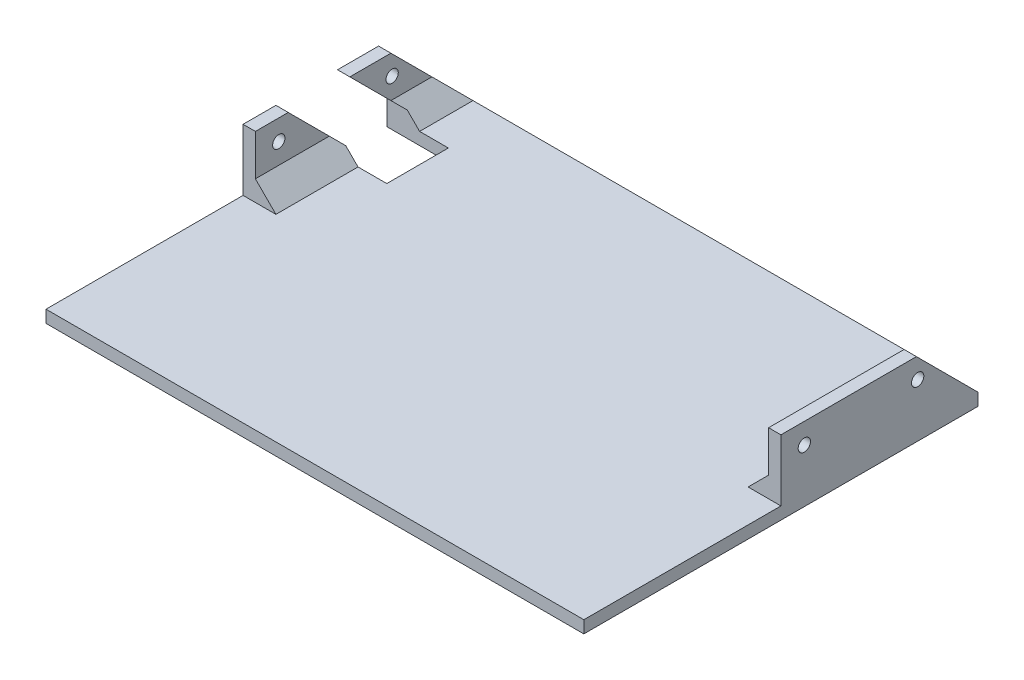
ISO-10303-21;
HEADER;
FILE_DESCRIPTION(('STEP AP214'),'2;1');
FILE_NAME('part.step','',(''),(''),'','','');
FILE_SCHEMA(('AUTOMOTIVE_DESIGN { 1 0 10303 214 1 1 1 1 }'));
ENDSEC;
DATA;
#1=APPLICATION_CONTEXT('core data for automotive mechanical design processes');
#2=APPLICATION_PROTOCOL_DEFINITION('international standard','automotive_design',2000,#1);
#3=PRODUCT_CONTEXT('',#1,'mechanical');
#4=PRODUCT('Part','Part','',(#3));
#5=PRODUCT_RELATED_PRODUCT_CATEGORY('part','',(#4));
#6=PRODUCT_DEFINITION_FORMATION('','',#4);
#7=PRODUCT_DEFINITION_CONTEXT('part definition',#1,'design');
#8=PRODUCT_DEFINITION('design','',#6,#7);
#9=PRODUCT_DEFINITION_SHAPE('','',#8);
#10=(LENGTH_UNIT() NAMED_UNIT(*) SI_UNIT(.MILLI.,.METRE.));
#11=(NAMED_UNIT(*) PLANE_ANGLE_UNIT() SI_UNIT($,.RADIAN.));
#12=(NAMED_UNIT(*) SI_UNIT($,.STERADIAN.) SOLID_ANGLE_UNIT());
#13=UNCERTAINTY_MEASURE_WITH_UNIT(LENGTH_MEASURE(1.E-05),#10,'distance_accuracy_value','');
#14=(GEOMETRIC_REPRESENTATION_CONTEXT(3) GLOBAL_UNCERTAINTY_ASSIGNED_CONTEXT((#13)) GLOBAL_UNIT_ASSIGNED_CONTEXT((#10,
#11,#12)) REPRESENTATION_CONTEXT('',''));
#15=CARTESIAN_POINT('',(0.,0.,0.));
#16=DIRECTION('',(0.,0.,1.));
#17=DIRECTION('',(1.,0.,0.));
#18=AXIS2_PLACEMENT_3D('',#15,#16,#17);
#19=CARTESIAN_POINT('',(-65.5,1.5,0.));
#20=DIRECTION('',(-1.,0.,0.));
#21=DIRECTION('',(0.,0.,1.));
#22=AXIS2_PLACEMENT_3D('',#19,#20,#21);
#23=PLANE('',#22);
#24=DIRECTION('',(0.,-1.,0.));
#25=VECTOR('',#24,1.);
#26=CARTESIAN_POINT('',(-65.5,4.5,-35.));
#27=LINE('',#26,#25);
#28=CARTESIAN_POINT('',(-65.5,4.5,-35.));
#29=VERTEX_POINT('',#28);
#30=CARTESIAN_POINT('',(-65.5,-1.5,-35.));
#31=VERTEX_POINT('',#30);
#32=EDGE_CURVE('E213',#29,#31,#27,.T.);
#33=ORIENTED_EDGE('',*,*,#32,.F.);
#34=DIRECTION('',(0.,-0.707106781186548,-0.707106781186547));
#35=VECTOR('',#34,1.);
#36=CARTESIAN_POINT('',(-65.5,16.5,-23.));
#37=LINE('',#36,#35);
#38=CARTESIAN_POINT('',(-65.5,16.5,-23.));
#39=VERTEX_POINT('',#38);
#40=EDGE_CURVE('E462',#39,#29,#37,.T.);
#41=ORIENTED_EDGE('',*,*,#40,.F.);
#42=DIRECTION('',(0.,0.,1.));
#43=VECTOR('',#42,1.);
#44=CARTESIAN_POINT('',(-65.5,16.5,0.));
#45=LINE('',#44,#43);
#46=CARTESIAN_POINT('',(-65.5,16.5,-32.9999999999998));
#47=VERTEX_POINT('',#46);
#48=EDGE_CURVE('E329',#47,#39,#45,.T.);
#49=ORIENTED_EDGE('',*,*,#48,.F.);
#50=DIRECTION('',(0.,0.707106781186544,0.707106781186551));
#51=VECTOR('',#50,1.);
#52=CARTESIAN_POINT('',(-65.5,24.75,-24.7499999999998));
#53=LINE('',#52,#51);
#54=CARTESIAN_POINT('',(-65.5,1.5,-48.));
#55=VERTEX_POINT('',#54);
#56=EDGE_CURVE('E301',#55,#47,#53,.T.);
#57=ORIENTED_EDGE('',*,*,#56,.F.);
#58=DIRECTION('',(0.,-1.,0.));
#59=VECTOR('',#58,1.);
#60=CARTESIAN_POINT('',(-65.5,1.5,-48.));
#61=LINE('',#60,#59);
#62=CARTESIAN_POINT('',(-65.5,-1.5,-48.));
#63=VERTEX_POINT('',#62);
#64=EDGE_CURVE('E365',#55,#63,#61,.T.);
#65=ORIENTED_EDGE('',*,*,#64,.T.);
#66=DIRECTION('',(0.,0.,-1.));
#67=VECTOR('',#66,1.);
#68=CARTESIAN_POINT('',(-65.5,-1.5,0.));
#69=LINE('',#68,#67);
#70=EDGE_CURVE('E339',#31,#63,#69,.T.);
#71=ORIENTED_EDGE('',*,*,#70,.F.);
#72=EDGE_LOOP('',(#33,#41,#49,#57,#65,#71));
#73=FACE_BOUND('',#72,.T.);
#74=CARTESIAN_POINT('',(-65.5,11.5,-33.3));
#75=DIRECTION('',(-1.,0.,0.));
#76=DIRECTION('',(0.,0.,1.));
#77=AXIS2_PLACEMENT_3D('',#74,#75,#76);
#78=CIRCLE('',#77,1.5);
#79=CARTESIAN_POINT('',(-65.5,11.5,-31.8));
#80=VERTEX_POINT('',#79);
#81=EDGE_CURVE('E321',#80,#80,#78,.T.);
#82=ORIENTED_EDGE('',*,*,#81,.F.);
#83=EDGE_LOOP('',(#82));
#84=FACE_BOUND('',#83,.T.);
#85=ADVANCED_FACE('F42',(#73,#84),#23,.T.);
#86=CARTESIAN_POINT('',(-62.5,16.5,0.));
#87=DIRECTION('',(0.,-1.,0.));
#88=DIRECTION('',(0.,0.,-1.));
#89=AXIS2_PLACEMENT_3D('',#86,#87,#88);
#90=PLANE('',#89);
#91=ORIENTED_EDGE('',*,*,#48,.T.);
#92=DIRECTION('',(-1.,0.,0.));
#93=VECTOR('',#92,1.);
#94=CARTESIAN_POINT('',(-50.5,16.5,-23.));
#95=LINE('',#94,#93);
#96=CARTESIAN_POINT('',(-62.5,16.5,-23.));
#97=VERTEX_POINT('',#96);
#98=EDGE_CURVE('E449',#97,#39,#95,.T.);
#99=ORIENTED_EDGE('',*,*,#98,.F.);
#100=DIRECTION('',(0.,0.,1.));
#101=VECTOR('',#100,1.);
#102=CARTESIAN_POINT('',(-62.5,16.5,0.));
#103=LINE('',#102,#101);
#104=CARTESIAN_POINT('',(-62.5,16.5,-32.9999999999998));
#105=VERTEX_POINT('',#104);
#106=EDGE_CURVE('E310',#105,#97,#103,.T.);
#107=ORIENTED_EDGE('',*,*,#106,.F.);
#108=DIRECTION('',(-1.,0.,0.));
#109=VECTOR('',#108,1.);
#110=CARTESIAN_POINT('',(-62.5,16.5,-32.9999999999998));
#111=LINE('',#110,#109);
#112=EDGE_CURVE('E342',#105,#47,#111,.T.);
#113=ORIENTED_EDGE('',*,*,#112,.T.);
#114=EDGE_LOOP('',(#91,#99,#107,#113));
#115=FACE_BOUND('',#114,.T.);
#116=ADVANCED_FACE('F447',(#115),#90,.F.);
#117=CARTESIAN_POINT('',(-62.5,0.,0.));
#118=DIRECTION('',(-1.,0.,0.));
#119=DIRECTION('',(0.,0.,1.));
#120=AXIS2_PLACEMENT_3D('',#117,#118,#119);
#121=PLANE('',#120);
#122=CARTESIAN_POINT('',(-62.5,11.5,-33.3));
#123=DIRECTION('',(-1.,0.,0.));
#124=DIRECTION('',(0.,0.,1.));
#125=AXIS2_PLACEMENT_3D('',#122,#123,#124);
#126=CIRCLE('',#125,1.5);
#127=CARTESIAN_POINT('',(-62.5,11.5,-31.8));
#128=VERTEX_POINT('',#127);
#129=EDGE_CURVE('E300',#128,#128,#126,.T.);
#130=ORIENTED_EDGE('',*,*,#129,.T.);
#131=EDGE_LOOP('',(#130));
#132=FACE_BOUND('',#131,.T.);
#133=ORIENTED_EDGE('',*,*,#106,.T.);
#134=DIRECTION('',(0.,-0.707106781186548,-0.707106781186547));
#135=VECTOR('',#134,1.);
#136=CARTESIAN_POINT('',(-62.5,19.75,-19.75));
#137=LINE('',#136,#135);
#138=CARTESIAN_POINT('',(-62.5,6.50000000000006,-32.9999999999999));
#139=VERTEX_POINT('',#138);
#140=EDGE_CURVE('E236',#97,#139,#137,.T.);
#141=ORIENTED_EDGE('',*,*,#140,.T.);
#142=DIRECTION('',(0.,0.,-1.));
#143=VECTOR('',#142,1.);
#144=CARTESIAN_POINT('',(-62.5,6.50000000000006,0.));
#145=LINE('',#144,#143);
#146=CARTESIAN_POINT('',(-62.5,6.50000000000006,-42.9999999999999));
#147=VERTEX_POINT('',#146);
#148=EDGE_CURVE('E402',#139,#147,#145,.T.);
#149=ORIENTED_EDGE('',*,*,#148,.T.);
#150=DIRECTION('',(0.,0.707106781186544,0.707106781186551));
#151=VECTOR('',#150,1.);
#152=CARTESIAN_POINT('',(-62.5,24.75,-24.7499999999998));
#153=LINE('',#152,#151);
#154=EDGE_CURVE('E314',#147,#105,#153,.T.);
#155=ORIENTED_EDGE('',*,*,#154,.T.);
#156=EDGE_LOOP('',(#133,#141,#149,#155));
#157=FACE_BOUND('',#156,.T.);
#158=ADVANCED_FACE('F442',(#132,#157),#121,.F.);
#159=CARTESIAN_POINT('',(-62.5,6.50000000000006,0.));
#160=DIRECTION('',(-0.707106781186553,-0.707106781186542,0.));
#161=DIRECTION('',(0.,0.,-1.));
#162=AXIS2_PLACEMENT_3D('',#159,#160,#161);
#163=PLANE('',#162);
#164=DIRECTION('',(0.57735026918962,-0.577350269189629,-0.577350269189629));
#165=VECTOR('',#164,1.);
#166=CARTESIAN_POINT('',(-73.4999999999999,17.5000000000001,-21.9999999999998));
#167=LINE('',#166,#165);
#168=CARTESIAN_POINT('',(-60.5,4.5,-35.));
#169=VERTEX_POINT('',#168);
#170=EDGE_CURVE('E52',#139,#169,#167,.T.);
#171=ORIENTED_EDGE('',*,*,#170,.T.);
#172=DIRECTION('',(0.707106781186542,-0.707106781186553,0.));
#173=VECTOR('',#172,1.);
#174=CARTESIAN_POINT('',(-62.5,6.50000000000006,-35.));
#175=LINE('',#174,#173);
#176=CARTESIAN_POINT('',(-57.5,1.5,-35.));
#177=VERTEX_POINT('',#176);
#178=EDGE_CURVE('E11',#169,#177,#175,.T.);
#179=ORIENTED_EDGE('',*,*,#178,.T.);
#180=DIRECTION('',(0.,0.,1.));
#181=VECTOR('',#180,1.);
#182=CARTESIAN_POINT('',(-57.5,1.5,0.));
#183=LINE('',#182,#181);
#184=CARTESIAN_POINT('',(-57.5,1.5,-48.));
#185=VERTEX_POINT('',#184);
#186=EDGE_CURVE('E391',#185,#177,#183,.T.);
#187=ORIENTED_EDGE('',*,*,#186,.F.);
#188=DIRECTION('',(0.577350269189618,-0.577350269189627,-0.577350269189633));
#189=VECTOR('',#188,1.);
#190=CARTESIAN_POINT('',(-74.6666666666666,18.6666666666668,-30.833333333333));
#191=LINE('',#190,#189);
#192=EDGE_CURVE('E414',#147,#185,#191,.T.);
#193=ORIENTED_EDGE('',*,*,#192,.F.);
#194=ORIENTED_EDGE('',*,*,#148,.F.);
#195=EDGE_LOOP('',(#171,#179,#187,#193,#194));
#196=FACE_BOUND('',#195,.T.);
#197=ADVANCED_FACE('F432',(#196),#163,.F.);
#198=DIRECTION('',(0.,0.707106781186548,0.707106781186547));
#199=VECTOR('',#198,1.);
#200=CARTESIAN_POINT('',(-65.5,4.5,-20.));
#201=LINE('',#200,#199);
#202=CARTESIAN_POINT('',(-65.5,4.5,-20.));
#203=VERTEX_POINT('',#202);
#204=CARTESIAN_POINT('',(-65.5,16.5,-7.99999999999999));
#205=VERTEX_POINT('',#204);
#206=EDGE_CURVE('E465',#203,#205,#201,.T.);
#207=ORIENTED_EDGE('',*,*,#206,.F.);
#208=DIRECTION('',(0.,1.,0.));
#209=VECTOR('',#208,1.);
#210=CARTESIAN_POINT('',(-65.5,-1.5,-20.));
#211=LINE('',#210,#209);
#212=CARTESIAN_POINT('',(-65.5,-1.5,-20.));
#213=VERTEX_POINT('',#212);
#214=EDGE_CURVE('E468',#213,#203,#211,.T.);
#215=ORIENTED_EDGE('',*,*,#214,.F.);
#216=CARTESIAN_POINT('',(-65.5,-1.5,48.));
#217=VERTEX_POINT('',#216);
#218=EDGE_CURVE('E219',#217,#213,#69,.T.);
#219=ORIENTED_EDGE('',*,*,#218,.F.);
#220=DIRECTION('',(0.,-1.,0.));
#221=VECTOR('',#220,1.);
#222=CARTESIAN_POINT('',(-65.5,1.5,48.));
#223=LINE('',#222,#221);
#224=CARTESIAN_POINT('',(-65.5,1.5,48.));
#225=VERTEX_POINT('',#224);
#226=EDGE_CURVE('E387',#225,#217,#223,.T.);
#227=ORIENTED_EDGE('',*,*,#226,.F.);
#228=DIRECTION('',(0.,0.,-1.));
#229=VECTOR('',#228,1.);
#230=CARTESIAN_POINT('',(-65.5,1.5,0.));
#231=LINE('',#230,#229);
#232=CARTESIAN_POINT('',(-65.5,1.5,0.));
#233=VERTEX_POINT('',#232);
#234=EDGE_CURVE('E349',#225,#233,#231,.T.);
#235=ORIENTED_EDGE('',*,*,#234,.T.);
#236=DIRECTION('',(0.,-1.,0.));
#237=VECTOR('',#236,1.);
#238=CARTESIAN_POINT('',(-65.5,0.,0.));
#239=LINE('',#238,#237);
#240=CARTESIAN_POINT('',(-65.5,16.5,0.));
#241=VERTEX_POINT('',#240);
#242=EDGE_CURVE('E325',#241,#233,#239,.T.);
#243=ORIENTED_EDGE('',*,*,#242,.F.);
#244=EDGE_CURVE('E328',#205,#241,#45,.T.);
#245=ORIENTED_EDGE('',*,*,#244,.F.);
#246=EDGE_LOOP('',(#207,#215,#219,#227,#235,#243,#245));
#247=FACE_BOUND('',#246,.T.);
#248=CARTESIAN_POINT('',(-65.5,11.5,-5.69999999999999));
#249=DIRECTION('',(-1.,0.,0.));
#250=DIRECTION('',(0.,0.,1.));
#251=AXIS2_PLACEMENT_3D('',#248,#249,#250);
#252=CIRCLE('',#251,1.5);
#253=CARTESIAN_POINT('',(-65.5,11.5,-4.19999999999999));
#254=VERTEX_POINT('',#253);
#255=EDGE_CURVE('E289',#254,#254,#252,.T.);
#256=ORIENTED_EDGE('',*,*,#255,.F.);
#257=EDGE_LOOP('',(#256));
#258=FACE_BOUND('',#257,.T.);
#259=ADVANCED_FACE('F473',(#247,#258),#23,.T.);
#260=CARTESIAN_POINT('',(0.,1.5,48.));
#261=DIRECTION('',(0.,0.,1.));
#262=DIRECTION('',(1.,0.,0.));
#263=AXIS2_PLACEMENT_3D('',#260,#261,#262);
#264=PLANE('',#263);
#265=DIRECTION('',(-1.,0.,0.));
#266=VECTOR('',#265,1.);
#267=CARTESIAN_POINT('',(0.,-1.5,48.));
#268=LINE('',#267,#266);
#269=CARTESIAN_POINT('',(65.5,-1.5,48.));
#270=VERTEX_POINT('',#269);
#271=EDGE_CURVE('E368',#270,#217,#268,.T.);
#272=ORIENTED_EDGE('',*,*,#271,.F.);
#273=DIRECTION('',(0.,-1.,0.));
#274=VECTOR('',#273,1.);
#275=CARTESIAN_POINT('',(65.5,1.5,48.));
#276=LINE('',#275,#274);
#277=CARTESIAN_POINT('',(65.5,1.5,48.));
#278=VERTEX_POINT('',#277);
#279=EDGE_CURVE('E384',#278,#270,#276,.T.);
#280=ORIENTED_EDGE('',*,*,#279,.F.);
#281=DIRECTION('',(-1.,0.,0.));
#282=VECTOR('',#281,1.);
#283=CARTESIAN_POINT('',(0.,1.5,48.));
#284=LINE('',#283,#282);
#285=EDGE_CURVE('E353',#278,#225,#284,.T.);
#286=ORIENTED_EDGE('',*,*,#285,.T.);
#287=ORIENTED_EDGE('',*,*,#226,.T.);
#288=EDGE_LOOP('',(#272,#280,#286,#287));
#289=FACE_BOUND('',#288,.T.);
#290=ADVANCED_FACE('F505',(#289),#264,.T.);
#291=CARTESIAN_POINT('',(65.5,1.5,0.));
#292=DIRECTION('',(-1.,0.,0.));
#293=DIRECTION('',(0.,0.,1.));
#294=AXIS2_PLACEMENT_3D('',#291,#292,#293);
#295=PLANE('',#294);
#296=DIRECTION('',(0.,0.,-1.));
#297=VECTOR('',#296,1.);
#298=CARTESIAN_POINT('',(65.5,-1.5,0.));
#299=LINE('',#298,#297);
#300=CARTESIAN_POINT('',(65.5,-1.5,-48.));
#301=VERTEX_POINT('',#300);
#302=EDGE_CURVE('E371',#270,#301,#299,.T.);
#303=ORIENTED_EDGE('',*,*,#302,.T.);
#304=DIRECTION('',(0.,-1.,0.));
#305=VECTOR('',#304,1.);
#306=CARTESIAN_POINT('',(65.5,1.5,-48.));
#307=LINE('',#306,#305);
#308=CARTESIAN_POINT('',(65.5,1.5,-48.));
#309=VERTEX_POINT('',#308);
#310=EDGE_CURVE('E380',#309,#301,#307,.T.);
#311=ORIENTED_EDGE('',*,*,#310,.F.);
#312=DIRECTION('',(0.,0.707106781186544,0.707106781186551));
#313=VECTOR('',#312,1.);
#314=CARTESIAN_POINT('',(65.5,24.75,-24.7499999999998));
#315=LINE('',#314,#313);
#316=CARTESIAN_POINT('',(65.5,16.5,-32.9999999999998));
#317=VERTEX_POINT('',#316);
#318=EDGE_CURVE('E279',#309,#317,#315,.T.);
#319=ORIENTED_EDGE('',*,*,#318,.T.);
#320=DIRECTION('',(0.,0.,1.));
#321=VECTOR('',#320,1.);
#322=CARTESIAN_POINT('',(65.5,16.5,0.));
#323=LINE('',#322,#321);
#324=CARTESIAN_POINT('',(65.5,16.5,0.));
#325=VERTEX_POINT('',#324);
#326=EDGE_CURVE('E252',#317,#325,#323,.T.);
#327=ORIENTED_EDGE('',*,*,#326,.T.);
#328=DIRECTION('',(0.,-1.,0.));
#329=VECTOR('',#328,1.);
#330=CARTESIAN_POINT('',(65.5,0.,0.));
#331=LINE('',#330,#329);
#332=CARTESIAN_POINT('',(65.5,1.5,0.));
#333=VERTEX_POINT('',#332);
#334=EDGE_CURVE('E275',#325,#333,#331,.T.);
#335=ORIENTED_EDGE('',*,*,#334,.T.);
#336=DIRECTION('',(0.,0.,-1.));
#337=VECTOR('',#336,1.);
#338=CARTESIAN_POINT('',(65.5,1.5,0.));
#339=LINE('',#338,#337);
#340=EDGE_CURVE('E358',#278,#333,#339,.T.);
#341=ORIENTED_EDGE('',*,*,#340,.F.);
#342=ORIENTED_EDGE('',*,*,#279,.T.);
#343=EDGE_LOOP('',(#303,#311,#319,#327,#335,#341,#342));
#344=FACE_BOUND('',#343,.T.);
#345=CARTESIAN_POINT('',(65.5,11.5,-5.69999999999999));
#346=DIRECTION('',(-1.,0.,0.));
#347=DIRECTION('',(0.,0.,1.));
#348=AXIS2_PLACEMENT_3D('',#345,#346,#347);
#349=CIRCLE('',#348,1.5);
#350=CARTESIAN_POINT('',(65.5,11.5,-4.19999999999999));
#351=VERTEX_POINT('',#350);
#352=EDGE_CURVE('E246',#351,#351,#349,.T.);
#353=ORIENTED_EDGE('',*,*,#352,.T.);
#354=EDGE_LOOP('',(#353));
#355=FACE_BOUND('',#354,.T.);
#356=CARTESIAN_POINT('',(65.5,11.5,-33.3));
#357=DIRECTION('',(-1.,0.,0.));
#358=DIRECTION('',(0.,0.,1.));
#359=AXIS2_PLACEMENT_3D('',#356,#357,#358);
#360=CIRCLE('',#359,1.5);
#361=CARTESIAN_POINT('',(65.5,11.5,-31.8));
#362=VERTEX_POINT('',#361);
#363=EDGE_CURVE('E271',#362,#362,#360,.T.);
#364=ORIENTED_EDGE('',*,*,#363,.T.);
#365=EDGE_LOOP('',(#364));
#366=FACE_BOUND('',#365,.T.);
#367=ADVANCED_FACE('F509',(#344,#355,#366),#295,.F.);
#368=CARTESIAN_POINT('',(0.,1.5,-48.));
#369=DIRECTION('',(0.,0.,1.));
#370=DIRECTION('',(1.,0.,0.));
#371=AXIS2_PLACEMENT_3D('',#368,#369,#370);
#372=PLANE('',#371);
#373=DIRECTION('',(-1.,0.,0.));
#374=VECTOR('',#373,1.);
#375=CARTESIAN_POINT('',(0.,-1.5,-48.));
#376=LINE('',#375,#374);
#377=EDGE_CURVE('E354',#301,#63,#376,.T.);
#378=ORIENTED_EDGE('',*,*,#377,.T.);
#379=ORIENTED_EDGE('',*,*,#64,.F.);
#380=DIRECTION('',(-1.,0.,0.));
#381=VECTOR('',#380,1.);
#382=CARTESIAN_POINT('',(-62.5,1.5,-48.));
#383=LINE('',#382,#381);
#384=EDGE_CURVE('E67',#185,#55,#383,.T.);
#385=ORIENTED_EDGE('',*,*,#384,.F.);
#386=DIRECTION('',(-1.,0.,0.));
#387=VECTOR('',#386,1.);
#388=CARTESIAN_POINT('',(0.,1.5,-48.));
#389=LINE('',#388,#387);
#390=CARTESIAN_POINT('',(57.5,1.5,-48.));
#391=VERTEX_POINT('',#390);
#392=EDGE_CURVE('E361',#391,#185,#389,.T.);
#393=ORIENTED_EDGE('',*,*,#392,.F.);
#394=EDGE_CURVE('E362',#309,#391,#389,.T.);
#395=ORIENTED_EDGE('',*,*,#394,.F.);
#396=ORIENTED_EDGE('',*,*,#310,.T.);
#397=EDGE_LOOP('',(#378,#379,#385,#393,#395,#396));
#398=FACE_BOUND('',#397,.T.);
#399=ADVANCED_FACE('F521',(#398),#372,.F.);
#400=CARTESIAN_POINT('',(0.,1.5,0.));
#401=DIRECTION('',(0.,1.,0.));
#402=DIRECTION('',(0.,0.,1.));
#403=AXIS2_PLACEMENT_3D('',#400,#401,#402);
#404=PLANE('',#403);
#405=DIRECTION('',(-1.,0.,0.));
#406=VECTOR('',#405,1.);
#407=CARTESIAN_POINT('',(0.,1.5,-35.));
#408=LINE('',#407,#406);
#409=CARTESIAN_POINT('',(-50.5,1.5,-35.));
#410=VERTEX_POINT('',#409);
#411=EDGE_CURVE('E240',#410,#177,#408,.T.);
#412=ORIENTED_EDGE('',*,*,#411,.F.);
#413=DIRECTION('',(0.,0.,1.));
#414=VECTOR('',#413,1.);
#415=CARTESIAN_POINT('',(-50.5,1.5,0.));
#416=LINE('',#415,#414);
#417=CARTESIAN_POINT('',(-50.5,1.5,-20.));
#418=VERTEX_POINT('',#417);
#419=EDGE_CURVE('E243',#410,#418,#416,.T.);
#420=ORIENTED_EDGE('',*,*,#419,.T.);
#421=DIRECTION('',(1.,0.,0.));
#422=VECTOR('',#421,1.);
#423=CARTESIAN_POINT('',(0.,1.5,-20.));
#424=LINE('',#423,#422);
#425=CARTESIAN_POINT('',(-57.5,1.5,-20.));
#426=VERTEX_POINT('',#425);
#427=EDGE_CURVE('E199',#426,#418,#424,.T.);
#428=ORIENTED_EDGE('',*,*,#427,.F.);
#429=CARTESIAN_POINT('',(-57.5,1.5,0.));
#430=VERTEX_POINT('',#429);
#431=EDGE_CURVE('E390',#426,#430,#183,.T.);
#432=ORIENTED_EDGE('',*,*,#431,.T.);
#433=DIRECTION('',(-1.,0.,0.));
#434=VECTOR('',#433,1.);
#435=CARTESIAN_POINT('',(-62.5,1.5,0.));
#436=LINE('',#435,#434);
#437=EDGE_CURVE('E335',#430,#233,#436,.T.);
#438=ORIENTED_EDGE('',*,*,#437,.T.);
#439=ORIENTED_EDGE('',*,*,#234,.F.);
#440=ORIENTED_EDGE('',*,*,#285,.F.);
#441=ORIENTED_EDGE('',*,*,#340,.T.);
#442=DIRECTION('',(1.,0.,0.));
#443=VECTOR('',#442,1.);
#444=CARTESIAN_POINT('',(62.5,1.5,0.));
#445=LINE('',#444,#443);
#446=CARTESIAN_POINT('',(57.5,1.5,0.));
#447=VERTEX_POINT('',#446);
#448=EDGE_CURVE('E267',#447,#333,#445,.T.);
#449=ORIENTED_EDGE('',*,*,#448,.F.);
#450=DIRECTION('',(0.,0.,-1.));
#451=VECTOR('',#450,1.);
#452=CARTESIAN_POINT('',(57.5,1.5,0.));
#453=LINE('',#452,#451);
#454=EDGE_CURVE('E395',#447,#391,#453,.T.);
#455=ORIENTED_EDGE('',*,*,#454,.T.);
#456=ORIENTED_EDGE('',*,*,#392,.T.);
#457=ORIENTED_EDGE('',*,*,#186,.T.);
#458=EDGE_LOOP('',(#412,#420,#428,#432,#438,#439,#440,#441,#449,#455,#456,#457));
#459=FACE_BOUND('',#458,.T.);
#460=ADVANCED_FACE('F494',(#459),#404,.T.);
#461=CARTESIAN_POINT('',(0.,-1.5,0.));
#462=DIRECTION('',(0.,1.,0.));
#463=DIRECTION('',(0.,0.,1.));
#464=AXIS2_PLACEMENT_3D('',#461,#462,#463);
#465=PLANE('',#464);
#466=DIRECTION('',(0.,0.,1.));
#467=VECTOR('',#466,1.);
#468=CARTESIAN_POINT('',(-50.5,-1.5,-35.));
#469=LINE('',#468,#467);
#470=CARTESIAN_POINT('',(-50.5,-1.5,-35.));
#471=VERTEX_POINT('',#470);
#472=CARTESIAN_POINT('',(-50.5,-1.5,-20.));
#473=VERTEX_POINT('',#472);
#474=EDGE_CURVE('E204',#471,#473,#469,.T.);
#475=ORIENTED_EDGE('',*,*,#474,.F.);
#476=DIRECTION('',(-1.,0.,0.));
#477=VECTOR('',#476,1.);
#478=CARTESIAN_POINT('',(-50.5,-1.5,-35.));
#479=LINE('',#478,#477);
#480=EDGE_CURVE('E232',#471,#31,#479,.T.);
#481=ORIENTED_EDGE('',*,*,#480,.T.);
#482=ORIENTED_EDGE('',*,*,#70,.T.);
#483=ORIENTED_EDGE('',*,*,#377,.F.);
#484=ORIENTED_EDGE('',*,*,#302,.F.);
#485=ORIENTED_EDGE('',*,*,#271,.T.);
#486=ORIENTED_EDGE('',*,*,#218,.T.);
#487=DIRECTION('',(-1.,0.,0.));
#488=VECTOR('',#487,1.);
#489=CARTESIAN_POINT('',(-50.5,-1.5,-20.));
#490=LINE('',#489,#488);
#491=EDGE_CURVE('E196',#473,#213,#490,.T.);
#492=ORIENTED_EDGE('',*,*,#491,.F.);
#493=EDGE_LOOP('',(#475,#481,#482,#483,#484,#485,#486,#492));
#494=FACE_BOUND('',#493,.T.);
#495=ADVANCED_FACE('F216',(#494),#465,.F.);
#496=CARTESIAN_POINT('',(-62.5,0.,0.));
#497=DIRECTION('',(0.,0.,-1.));
#498=DIRECTION('',(0.,1.,0.));
#499=AXIS2_PLACEMENT_3D('',#496,#497,#498);
#500=PLANE('',#499);
#501=ORIENTED_EDGE('',*,*,#242,.T.);
#502=ORIENTED_EDGE('',*,*,#437,.F.);
#503=DIRECTION('',(-0.707106781186542,0.707106781186553,0.));
#504=VECTOR('',#503,1.);
#505=CARTESIAN_POINT('',(-59.25,3.24999999999998,0.));
#506=LINE('',#505,#504);
#507=CARTESIAN_POINT('',(-62.5,6.50000000000006,0.));
#508=VERTEX_POINT('',#507);
#509=EDGE_CURVE('E418',#430,#508,#506,.T.);
#510=ORIENTED_EDGE('',*,*,#509,.T.);
#511=DIRECTION('',(0.,-1.,0.));
#512=VECTOR('',#511,1.);
#513=CARTESIAN_POINT('',(-62.5,0.,0.));
#514=LINE('',#513,#512);
#515=CARTESIAN_POINT('',(-62.5,16.5,0.));
#516=VERTEX_POINT('',#515);
#517=EDGE_CURVE('E305',#516,#508,#514,.T.);
#518=ORIENTED_EDGE('',*,*,#517,.F.);
#519=DIRECTION('',(-1.,0.,0.));
#520=VECTOR('',#519,1.);
#521=CARTESIAN_POINT('',(-62.5,16.5,0.));
#522=LINE('',#521,#520);
#523=EDGE_CURVE('E317',#516,#241,#522,.T.);
#524=ORIENTED_EDGE('',*,*,#523,.T.);
#525=EDGE_LOOP('',(#501,#502,#510,#518,#524));
#526=FACE_BOUND('',#525,.T.);
#527=ADVANCED_FACE('F499',(#526),#500,.F.);
#528=CARTESIAN_POINT('',(-62.5,24.75,-24.7499999999998));
#529=DIRECTION('',(0.,-0.707106781186551,0.707106781186544));
#530=DIRECTION('',(0.,-0.707106781186544,-0.707106781186551));
#531=AXIS2_PLACEMENT_3D('',#528,#529,#530);
#532=PLANE('',#531);
#533=ORIENTED_EDGE('',*,*,#56,.T.);
#534=ORIENTED_EDGE('',*,*,#112,.F.);
#535=ORIENTED_EDGE('',*,*,#154,.F.);
#536=ORIENTED_EDGE('',*,*,#192,.T.);
#537=ORIENTED_EDGE('',*,*,#384,.T.);
#538=EDGE_LOOP('',(#533,#534,#535,#536,#537));
#539=FACE_BOUND('',#538,.T.);
#540=ADVANCED_FACE('F595',(#539),#532,.F.);
#541=CARTESIAN_POINT('',(-62.5,11.5,-33.3));
#542=DIRECTION('',(-1.,0.,0.));
#543=DIRECTION('',(0.,0.,1.));
#544=AXIS2_PLACEMENT_3D('',#541,#542,#543);
#545=CYLINDRICAL_SURFACE('',#544,1.5);
#546=ORIENTED_EDGE('',*,*,#129,.F.);
#547=EDGE_LOOP('',(#546));
#548=FACE_BOUND('',#547,.T.);
#549=ORIENTED_EDGE('',*,*,#81,.T.);
#550=EDGE_LOOP('',(#549));
#551=FACE_BOUND('',#550,.T.);
#552=ADVANCED_FACE('F599',(#548,#551),#545,.F.);
#553=CARTESIAN_POINT('',(-62.5,11.5,-5.69999999999999));
#554=DIRECTION('',(-1.,0.,0.));
#555=DIRECTION('',(0.,0.,1.));
#556=AXIS2_PLACEMENT_3D('',#553,#554,#555);
#557=CYLINDRICAL_SURFACE('',#556,1.5);
#558=CARTESIAN_POINT('',(-62.5,11.5,-5.69999999999999));
#559=DIRECTION('',(-1.,0.,0.));
#560=DIRECTION('',(0.,0.,1.));
#561=AXIS2_PLACEMENT_3D('',#558,#559,#560);
#562=CIRCLE('',#561,1.5);
#563=CARTESIAN_POINT('',(-62.5,11.5,-4.19999999999999));
#564=VERTEX_POINT('',#563);
#565=EDGE_CURVE('E296',#564,#564,#562,.T.);
#566=ORIENTED_EDGE('',*,*,#565,.F.);
#567=EDGE_LOOP('',(#566));
#568=FACE_BOUND('',#567,.T.);
#569=ORIENTED_EDGE('',*,*,#255,.T.);
#570=EDGE_LOOP('',(#569));
#571=FACE_BOUND('',#570,.T.);
#572=ADVANCED_FACE('F605',(#568,#571),#557,.F.);
#573=CARTESIAN_POINT('',(-62.5,16.5,-7.99999999999999));
#574=VERTEX_POINT('',#573);
#575=EDGE_CURVE('E309',#574,#516,#103,.T.);
#576=ORIENTED_EDGE('',*,*,#575,.F.);
#577=DIRECTION('',(-1.,0.,0.));
#578=VECTOR('',#577,1.);
#579=CARTESIAN_POINT('',(-50.5,16.5,-7.99999999999999));
#580=LINE('',#579,#578);
#581=EDGE_CURVE('E224',#574,#205,#580,.T.);
#582=ORIENTED_EDGE('',*,*,#581,.T.);
#583=ORIENTED_EDGE('',*,*,#244,.T.);
#584=ORIENTED_EDGE('',*,*,#523,.F.);
#585=EDGE_LOOP('',(#576,#582,#583,#584));
#586=FACE_BOUND('',#585,.T.);
#587=ADVANCED_FACE('F480',(#586),#90,.F.);
#588=ORIENTED_EDGE('',*,*,#565,.T.);
#589=EDGE_LOOP('',(#588));
#590=FACE_BOUND('',#589,.T.);
#591=CARTESIAN_POINT('',(-62.5,6.50000000000006,-17.9999999999999));
#592=VERTEX_POINT('',#591);
#593=EDGE_CURVE('E403',#508,#592,#145,.T.);
#594=ORIENTED_EDGE('',*,*,#593,.T.);
#595=DIRECTION('',(0.,0.707106781186548,0.707106781186547));
#596=VECTOR('',#595,1.);
#597=CARTESIAN_POINT('',(-62.5,12.25,-12.25));
#598=LINE('',#597,#596);
#599=EDGE_CURVE('E231',#592,#574,#598,.T.);
#600=ORIENTED_EDGE('',*,*,#599,.T.);
#601=ORIENTED_EDGE('',*,*,#575,.T.);
#602=ORIENTED_EDGE('',*,*,#517,.T.);
#603=EDGE_LOOP('',(#594,#600,#601,#602));
#604=FACE_BOUND('',#603,.T.);
#605=ADVANCED_FACE('F501',(#590,#604),#121,.F.);
#606=CARTESIAN_POINT('',(62.5,0.,0.));
#607=DIRECTION('',(0.,0.,1.));
#608=DIRECTION('',(0.,-1.,0.));
#609=AXIS2_PLACEMENT_3D('',#606,#607,#608);
#610=PLANE('',#609);
#611=ORIENTED_EDGE('',*,*,#334,.F.);
#612=DIRECTION('',(1.,0.,0.));
#613=VECTOR('',#612,1.);
#614=CARTESIAN_POINT('',(62.5,16.5,0.));
#615=LINE('',#614,#613);
#616=CARTESIAN_POINT('',(62.5,16.5,0.));
#617=VERTEX_POINT('',#616);
#618=EDGE_CURVE('E286',#617,#325,#615,.T.);
#619=ORIENTED_EDGE('',*,*,#618,.F.);
#620=DIRECTION('',(0.,-1.,0.));
#621=VECTOR('',#620,1.);
#622=CARTESIAN_POINT('',(62.5,0.,0.));
#623=LINE('',#622,#621);
#624=CARTESIAN_POINT('',(62.5,6.49999999999998,0.));
#625=VERTEX_POINT('',#624);
#626=EDGE_CURVE('E256',#617,#625,#623,.T.);
#627=ORIENTED_EDGE('',*,*,#626,.T.);
#628=DIRECTION('',(-0.70710678118655,-0.707106781186545,0.));
#629=VECTOR('',#628,1.);
#630=CARTESIAN_POINT('',(57.5,1.5,0.));
#631=LINE('',#630,#629);
#632=EDGE_CURVE('E410',#625,#447,#631,.T.);
#633=ORIENTED_EDGE('',*,*,#632,.T.);
#634=ORIENTED_EDGE('',*,*,#448,.T.);
#635=EDGE_LOOP('',(#611,#619,#627,#633,#634));
#636=FACE_BOUND('',#635,.T.);
#637=ADVANCED_FACE('F513',(#636),#610,.T.);
#638=CARTESIAN_POINT('',(62.5,16.5,0.));
#639=DIRECTION('',(0.,1.,0.));
#640=DIRECTION('',(0.,0.,1.));
#641=AXIS2_PLACEMENT_3D('',#638,#639,#640);
#642=PLANE('',#641);
#643=ORIENTED_EDGE('',*,*,#326,.F.);
#644=DIRECTION('',(1.,0.,0.));
#645=VECTOR('',#644,1.);
#646=CARTESIAN_POINT('',(62.5,16.5,-32.9999999999998));
#647=LINE('',#646,#645);
#648=CARTESIAN_POINT('',(62.5,16.5,-32.9999999999998));
#649=VERTEX_POINT('',#648);
#650=EDGE_CURVE('E290',#649,#317,#647,.T.);
#651=ORIENTED_EDGE('',*,*,#650,.F.);
#652=DIRECTION('',(0.,0.,1.));
#653=VECTOR('',#652,1.);
#654=CARTESIAN_POINT('',(62.5,16.5,0.));
#655=LINE('',#654,#653);
#656=EDGE_CURVE('E263',#649,#617,#655,.T.);
#657=ORIENTED_EDGE('',*,*,#656,.T.);
#658=ORIENTED_EDGE('',*,*,#618,.T.);
#659=EDGE_LOOP('',(#643,#651,#657,#658));
#660=FACE_BOUND('',#659,.T.);
#661=ADVANCED_FACE('F532',(#660),#642,.T.);
#662=CARTESIAN_POINT('',(62.5,24.75,-24.7499999999998));
#663=DIRECTION('',(0.,0.707106781186551,-0.707106781186544));
#664=DIRECTION('',(0.,0.707106781186544,0.707106781186551));
#665=AXIS2_PLACEMENT_3D('',#662,#663,#664);
#666=PLANE('',#665);
#667=ORIENTED_EDGE('',*,*,#318,.F.);
#668=ORIENTED_EDGE('',*,*,#394,.T.);
#669=DIRECTION('',(0.577350269189627,0.577350269189622,0.577350269189628));
#670=VECTOR('',#669,1.);
#671=CARTESIAN_POINT('',(73.5000000000001,17.5,-31.9999999999999));
#672=LINE('',#671,#670);
#673=CARTESIAN_POINT('',(62.5,6.49999999999997,-43.));
#674=VERTEX_POINT('',#673);
#675=EDGE_CURVE('E407',#391,#674,#672,.T.);
#676=ORIENTED_EDGE('',*,*,#675,.T.);
#677=DIRECTION('',(0.,0.707106781186544,0.707106781186551));
#678=VECTOR('',#677,1.);
#679=CARTESIAN_POINT('',(62.5,24.75,-24.7499999999998));
#680=LINE('',#679,#678);
#681=EDGE_CURVE('E260',#674,#649,#680,.T.);
#682=ORIENTED_EDGE('',*,*,#681,.T.);
#683=ORIENTED_EDGE('',*,*,#650,.T.);
#684=EDGE_LOOP('',(#667,#668,#676,#682,#683));
#685=FACE_BOUND('',#684,.T.);
#686=ADVANCED_FACE('F527',(#685),#666,.T.);
#687=CARTESIAN_POINT('',(62.5,11.5,-33.3));
#688=DIRECTION('',(1.,0.,0.));
#689=DIRECTION('',(0.,0.,-1.));
#690=AXIS2_PLACEMENT_3D('',#687,#688,#689);
#691=CYLINDRICAL_SURFACE('',#690,1.5);
#692=CARTESIAN_POINT('',(62.5,11.5,-33.3));
#693=DIRECTION('',(-1.,0.,0.));
#694=DIRECTION('',(0.,0.,1.));
#695=AXIS2_PLACEMENT_3D('',#692,#693,#694);
#696=CIRCLE('',#695,1.5);
#697=CARTESIAN_POINT('',(62.5,11.5,-31.8));
#698=VERTEX_POINT('',#697);
#699=EDGE_CURVE('E251',#698,#698,#696,.T.);
#700=ORIENTED_EDGE('',*,*,#699,.T.);
#701=EDGE_LOOP('',(#700));
#702=FACE_BOUND('',#701,.T.);
#703=ORIENTED_EDGE('',*,*,#363,.F.);
#704=EDGE_LOOP('',(#703));
#705=FACE_BOUND('',#704,.T.);
#706=ADVANCED_FACE('F543',(#702,#705),#691,.F.);
#707=CARTESIAN_POINT('',(62.5,11.5,-5.69999999999999));
#708=DIRECTION('',(1.,0.,0.));
#709=DIRECTION('',(0.,0.,-1.));
#710=AXIS2_PLACEMENT_3D('',#707,#708,#709);
#711=CYLINDRICAL_SURFACE('',#710,1.5);
#712=CARTESIAN_POINT('',(62.5,11.5,-5.69999999999999));
#713=DIRECTION('',(-1.,0.,0.));
#714=DIRECTION('',(0.,0.,1.));
#715=AXIS2_PLACEMENT_3D('',#712,#713,#714);
#716=CIRCLE('',#715,1.5);
#717=CARTESIAN_POINT('',(62.5,11.5,-4.19999999999999));
#718=VERTEX_POINT('',#717);
#719=EDGE_CURVE('E247',#718,#718,#716,.T.);
#720=ORIENTED_EDGE('',*,*,#719,.T.);
#721=EDGE_LOOP('',(#720));
#722=FACE_BOUND('',#721,.T.);
#723=ORIENTED_EDGE('',*,*,#352,.F.);
#724=EDGE_LOOP('',(#723));
#725=FACE_BOUND('',#724,.T.);
#726=ADVANCED_FACE('F536',(#722,#725),#711,.F.);
#727=CARTESIAN_POINT('',(62.5,0.,0.));
#728=DIRECTION('',(1.,0.,0.));
#729=DIRECTION('',(0.,0.,1.));
#730=AXIS2_PLACEMENT_3D('',#727,#728,#729);
#731=PLANE('',#730);
#732=ORIENTED_EDGE('',*,*,#719,.F.);
#733=EDGE_LOOP('',(#732));
#734=FACE_BOUND('',#733,.T.);
#735=ORIENTED_EDGE('',*,*,#699,.F.);
#736=EDGE_LOOP('',(#735));
#737=FACE_BOUND('',#736,.T.);
#738=ORIENTED_EDGE('',*,*,#681,.F.);
#739=DIRECTION('',(0.,0.,1.));
#740=VECTOR('',#739,1.);
#741=CARTESIAN_POINT('',(62.5,6.49999999999998,0.));
#742=LINE('',#741,#740);
#743=EDGE_CURVE('E399',#674,#625,#742,.T.);
#744=ORIENTED_EDGE('',*,*,#743,.T.);
#745=ORIENTED_EDGE('',*,*,#626,.F.);
#746=ORIENTED_EDGE('',*,*,#656,.F.);
#747=EDGE_LOOP('',(#738,#744,#745,#746));
#748=FACE_BOUND('',#747,.T.);
#749=ADVANCED_FACE('F534',(#734,#737,#748),#731,.F.);
#750=CARTESIAN_POINT('',(57.5,1.5,0.));
#751=DIRECTION('',(0.707106781186545,-0.70710678118655,0.));
#752=DIRECTION('',(0.,0.,-1.));
#753=AXIS2_PLACEMENT_3D('',#750,#751,#752);
#754=PLANE('',#753);
#755=ORIENTED_EDGE('',*,*,#632,.F.);
#756=ORIENTED_EDGE('',*,*,#743,.F.);
#757=ORIENTED_EDGE('',*,*,#675,.F.);
#758=ORIENTED_EDGE('',*,*,#454,.F.);
#759=EDGE_LOOP('',(#755,#756,#757,#758));
#760=FACE_BOUND('',#759,.T.);
#761=ADVANCED_FACE('F520',(#760),#754,.F.);
#762=DIRECTION('',(-0.707106781186542,0.707106781186553,0.));
#763=VECTOR('',#762,1.);
#764=CARTESIAN_POINT('',(-62.5,6.50000000000006,-20.));
#765=LINE('',#764,#763);
#766=CARTESIAN_POINT('',(-60.5,4.5,-20.));
#767=VERTEX_POINT('',#766);
#768=EDGE_CURVE('E421',#426,#767,#765,.T.);
#769=ORIENTED_EDGE('',*,*,#768,.T.);
#770=DIRECTION('',(-0.57735026918962,0.577350269189629,0.577350269189629));
#771=VECTOR('',#770,1.);
#772=CARTESIAN_POINT('',(-68.5,12.5000000000001,-11.9999999999999));
#773=LINE('',#772,#771);
#774=EDGE_CURVE('E425',#767,#592,#773,.T.);
#775=ORIENTED_EDGE('',*,*,#774,.T.);
#776=ORIENTED_EDGE('',*,*,#593,.F.);
#777=ORIENTED_EDGE('',*,*,#509,.F.);
#778=ORIENTED_EDGE('',*,*,#431,.F.);
#779=EDGE_LOOP('',(#769,#775,#776,#777,#778));
#780=FACE_BOUND('',#779,.T.);
#781=ADVANCED_FACE('F45',(#780),#163,.F.);
#782=CARTESIAN_POINT('',(-50.5,16.5,-23.));
#783=DIRECTION('',(0.,0.707106781186547,-0.707106781186548));
#784=DIRECTION('',(0.,0.707106781186548,0.707106781186547));
#785=AXIS2_PLACEMENT_3D('',#782,#783,#784);
#786=PLANE('',#785);
#787=ORIENTED_EDGE('',*,*,#98,.T.);
#788=ORIENTED_EDGE('',*,*,#40,.T.);
#789=DIRECTION('',(-1.,0.,0.));
#790=VECTOR('',#789,1.);
#791=CARTESIAN_POINT('',(-50.5,4.5,-35.));
#792=LINE('',#791,#790);
#793=EDGE_CURVE('E440',#169,#29,#792,.T.);
#794=ORIENTED_EDGE('',*,*,#793,.F.);
#795=ORIENTED_EDGE('',*,*,#170,.F.);
#796=ORIENTED_EDGE('',*,*,#140,.F.);
#797=EDGE_LOOP('',(#787,#788,#794,#795,#796));
#798=FACE_BOUND('',#797,.T.);
#799=ADVANCED_FACE('F437',(#798),#786,.F.);
#800=CARTESIAN_POINT('',(-50.5,4.5,-20.));
#801=DIRECTION('',(0.,-0.707106781186547,0.707106781186548));
#802=DIRECTION('',(0.,-0.707106781186548,-0.707106781186547));
#803=AXIS2_PLACEMENT_3D('',#800,#801,#802);
#804=PLANE('',#803);
#805=ORIENTED_EDGE('',*,*,#774,.F.);
#806=DIRECTION('',(-1.,0.,0.));
#807=VECTOR('',#806,1.);
#808=CARTESIAN_POINT('',(-50.5,4.5,-20.));
#809=LINE('',#808,#807);
#810=EDGE_CURVE('E59',#767,#203,#809,.T.);
#811=ORIENTED_EDGE('',*,*,#810,.T.);
#812=ORIENTED_EDGE('',*,*,#206,.T.);
#813=ORIENTED_EDGE('',*,*,#581,.F.);
#814=ORIENTED_EDGE('',*,*,#599,.F.);
#815=EDGE_LOOP('',(#805,#811,#812,#813,#814));
#816=FACE_BOUND('',#815,.T.);
#817=ADVANCED_FACE('F477',(#816),#804,.F.);
#818=CARTESIAN_POINT('',(-50.5,4.5,-35.));
#819=DIRECTION('',(0.,0.,-1.));
#820=DIRECTION('',(-1.,0.,0.));
#821=AXIS2_PLACEMENT_3D('',#818,#819,#820);
#822=PLANE('',#821);
#823=ORIENTED_EDGE('',*,*,#411,.T.);
#824=ORIENTED_EDGE('',*,*,#178,.F.);
#825=ORIENTED_EDGE('',*,*,#793,.T.);
#826=ORIENTED_EDGE('',*,*,#32,.T.);
#827=ORIENTED_EDGE('',*,*,#480,.F.);
#828=DIRECTION('',(0.,-1.,0.));
#829=VECTOR('',#828,1.);
#830=CARTESIAN_POINT('',(-50.5,4.5,-35.));
#831=LINE('',#830,#829);
#832=EDGE_CURVE('E203',#410,#471,#831,.T.);
#833=ORIENTED_EDGE('',*,*,#832,.F.);
#834=EDGE_LOOP('',(#823,#824,#825,#826,#827,#833));
#835=FACE_BOUND('',#834,.T.);
#836=ADVANCED_FACE('F582',(#835),#822,.F.);
#837=CARTESIAN_POINT('',(-50.5,-1.5,-20.));
#838=DIRECTION('',(0.,0.,1.));
#839=DIRECTION('',(1.,0.,0.));
#840=AXIS2_PLACEMENT_3D('',#837,#838,#839);
#841=PLANE('',#840);
#842=ORIENTED_EDGE('',*,*,#427,.T.);
#843=DIRECTION('',(0.,1.,0.));
#844=VECTOR('',#843,1.);
#845=CARTESIAN_POINT('',(-50.5,-1.5,-20.));
#846=LINE('',#845,#844);
#847=EDGE_CURVE('E192',#473,#418,#846,.T.);
#848=ORIENTED_EDGE('',*,*,#847,.F.);
#849=ORIENTED_EDGE('',*,*,#491,.T.);
#850=ORIENTED_EDGE('',*,*,#214,.T.);
#851=ORIENTED_EDGE('',*,*,#810,.F.);
#852=ORIENTED_EDGE('',*,*,#768,.F.);
#853=EDGE_LOOP('',(#842,#848,#849,#850,#851,#852));
#854=FACE_BOUND('',#853,.T.);
#855=ADVANCED_FACE('F194',(#854),#841,.F.);
#856=CARTESIAN_POINT('',(-50.5,0.,0.));
#857=DIRECTION('',(-1.,0.,0.));
#858=DIRECTION('',(0.,0.,1.));
#859=AXIS2_PLACEMENT_3D('',#856,#857,#858);
#860=PLANE('',#859);
#861=ORIENTED_EDGE('',*,*,#832,.T.);
#862=ORIENTED_EDGE('',*,*,#474,.T.);
#863=ORIENTED_EDGE('',*,*,#847,.T.);
#864=ORIENTED_EDGE('',*,*,#419,.F.);
#865=EDGE_LOOP('',(#861,#862,#863,#864));
#866=FACE_BOUND('',#865,.T.);
#867=ADVANCED_FACE('F207',(#866),#860,.T.);
#868=CLOSED_SHELL('',(#85,#116,#158,#197,#259,#290,#367,#399,#460,#495,#527,#540,#552,#572,#587,
#605,#637,#661,#686,#706,#726,#749,#761,#781,#799,#817,#836,#855,#867));
#869=MANIFOLD_SOLID_BREP('B2',#868);
#870=ADVANCED_BREP_SHAPE_REPRESENTATION('',(#18,#869),#14);
#871=SHAPE_DEFINITION_REPRESENTATION(#9,#870);
ENDSEC;
END-ISO-10303-21;
